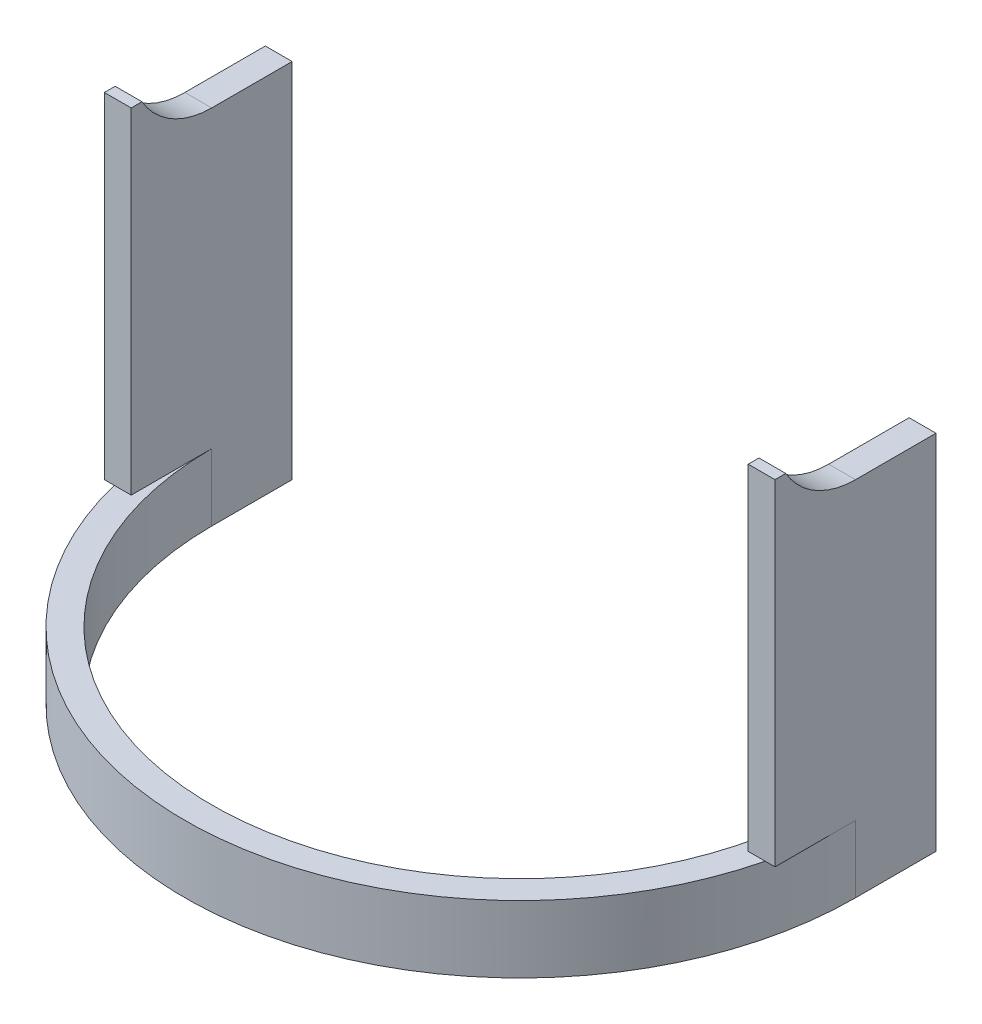
ISO-10303-21;
HEADER;
FILE_DESCRIPTION(('STEP AP214'),'2;1');
FILE_NAME('part.step','',(''),(''),'','','');
FILE_SCHEMA(('AUTOMOTIVE_DESIGN { 1 0 10303 214 1 1 1 1 }'));
ENDSEC;
DATA;
#1=APPLICATION_CONTEXT('core data for automotive mechanical design processes');
#2=APPLICATION_PROTOCOL_DEFINITION('international standard','automotive_design',2000,#1);
#3=PRODUCT_CONTEXT('',#1,'mechanical');
#4=PRODUCT('Part','Part','',(#3));
#5=PRODUCT_RELATED_PRODUCT_CATEGORY('part','',(#4));
#6=PRODUCT_DEFINITION_FORMATION('','',#4);
#7=PRODUCT_DEFINITION_CONTEXT('part definition',#1,'design');
#8=PRODUCT_DEFINITION('design','',#6,#7);
#9=PRODUCT_DEFINITION_SHAPE('','',#8);
#10=(LENGTH_UNIT() NAMED_UNIT(*) SI_UNIT(.MILLI.,.METRE.));
#11=(NAMED_UNIT(*) PLANE_ANGLE_UNIT() SI_UNIT($,.RADIAN.));
#12=(NAMED_UNIT(*) SI_UNIT($,.STERADIAN.) SOLID_ANGLE_UNIT());
#13=UNCERTAINTY_MEASURE_WITH_UNIT(LENGTH_MEASURE(1.E-05),#10,'distance_accuracy_value','');
#14=(GEOMETRIC_REPRESENTATION_CONTEXT(3) GLOBAL_UNCERTAINTY_ASSIGNED_CONTEXT((#13)) GLOBAL_UNIT_ASSIGNED_CONTEXT((#10,
#11,#12)) REPRESENTATION_CONTEXT('',''));
#15=CARTESIAN_POINT('',(0.,0.,0.));
#16=DIRECTION('',(0.,0.,1.));
#17=DIRECTION('',(1.,0.,0.));
#18=AXIS2_PLACEMENT_3D('',#15,#16,#17);
#19=CARTESIAN_POINT('',(0.,10.,0.));
#20=DIRECTION('',(0.,1.,0.));
#21=DIRECTION('',(0.,0.,1.));
#22=AXIS2_PLACEMENT_3D('',#19,#20,#21);
#23=PLANE('',#22);
#24=DIRECTION('',(1.,0.,0.));
#25=VECTOR('',#24,1.);
#26=CARTESIAN_POINT('',(50.,10.,12.));
#27=LINE('',#26,#25);
#28=CARTESIAN_POINT('',(46.,10.,12.));
#29=VERTEX_POINT('',#28);
#30=CARTESIAN_POINT('',(48.5386443980464,10.,12.));
#31=VERTEX_POINT('',#30);
#32=EDGE_CURVE('E194',#29,#31,#27,.T.);
#33=ORIENTED_EDGE('',*,*,#32,.F.);
#34=DIRECTION('',(0.,0.,-1.));
#35=VECTOR('',#34,1.);
#36=CARTESIAN_POINT('',(46.,10.,0.));
#37=LINE('',#36,#35);
#38=CARTESIAN_POINT('',(46.,10.,0.));
#39=VERTEX_POINT('',#38);
#40=EDGE_CURVE('E41',#29,#39,#37,.T.);
#41=ORIENTED_EDGE('',*,*,#40,.T.);
#42=CARTESIAN_POINT('',(0.,10.,0.));
#43=DIRECTION('',(0.,-1.,0.));
#44=DIRECTION('',(0.,0.,1.));
#45=AXIS2_PLACEMENT_3D('',#42,#43,#44);
#46=CIRCLE('',#45,46.);
#47=CARTESIAN_POINT('',(-46.,10.,0.));
#48=VERTEX_POINT('',#47);
#49=EDGE_CURVE('E233',#39,#48,#46,.T.);
#50=ORIENTED_EDGE('',*,*,#49,.T.);
#51=DIRECTION('',(0.,0.,-1.));
#52=VECTOR('',#51,1.);
#53=CARTESIAN_POINT('',(-46.,10.,-12.));
#54=LINE('',#53,#52);
#55=CARTESIAN_POINT('',(-46.,10.,12.));
#56=VERTEX_POINT('',#55);
#57=EDGE_CURVE('E211',#56,#48,#54,.T.);
#58=ORIENTED_EDGE('',*,*,#57,.F.);
#59=DIRECTION('',(1.,0.,0.));
#60=VECTOR('',#59,1.);
#61=CARTESIAN_POINT('',(-50.,10.,12.));
#62=LINE('',#61,#60);
#63=CARTESIAN_POINT('',(-48.5386443980464,10.,12.));
#64=VERTEX_POINT('',#63);
#65=EDGE_CURVE('E221',#64,#56,#62,.T.);
#66=ORIENTED_EDGE('',*,*,#65,.F.);
#67=CARTESIAN_POINT('',(0.,10.,0.));
#68=DIRECTION('',(0.,1.,0.));
#69=DIRECTION('',(0.,0.,1.));
#70=AXIS2_PLACEMENT_3D('',#67,#68,#69);
#71=CIRCLE('',#70,50.);
#72=EDGE_CURVE('E234',#64,#31,#71,.T.);
#73=ORIENTED_EDGE('',*,*,#72,.T.);
#74=EDGE_LOOP('',(#33,#41,#50,#58,#66,#73));
#75=FACE_BOUND('',#74,.T.);
#76=ADVANCED_FACE('F33',(#75),#23,.T.);
#77=CARTESIAN_POINT('',(0.,10.,0.));
#78=DIRECTION('',(0.,-1.,0.));
#79=DIRECTION('',(0.,0.,-1.));
#80=AXIS2_PLACEMENT_3D('',#77,#78,#79);
#81=CYLINDRICAL_SURFACE('',#80,50.);
#82=CARTESIAN_POINT('',(0.,0.,0.));
#83=DIRECTION('',(0.,1.,0.));
#84=DIRECTION('',(0.,0.,1.));
#85=AXIS2_PLACEMENT_3D('',#82,#83,#84);
#86=CIRCLE('',#85,50.);
#87=CARTESIAN_POINT('',(-50.,0.,0.));
#88=VERTEX_POINT('',#87);
#89=CARTESIAN_POINT('',(50.,0.,0.));
#90=VERTEX_POINT('',#89);
#91=EDGE_CURVE('E229',#88,#90,#86,.T.);
#92=ORIENTED_EDGE('',*,*,#91,.T.);
#93=DIRECTION('',(0.,-1.,0.));
#94=VECTOR('',#93,1.);
#95=CARTESIAN_POINT('',(50.,10.,0.));
#96=LINE('',#95,#94);
#97=CARTESIAN_POINT('',(50.,10.,0.));
#98=VERTEX_POINT('',#97);
#99=EDGE_CURVE('E274',#98,#90,#96,.T.);
#100=ORIENTED_EDGE('',*,*,#99,.F.);
#101=EDGE_CURVE('E235',#31,#98,#71,.T.);
#102=ORIENTED_EDGE('',*,*,#101,.F.);
#103=ORIENTED_EDGE('',*,*,#72,.F.);
#104=CARTESIAN_POINT('',(-50.,10.,0.));
#105=VERTEX_POINT('',#104);
#106=EDGE_CURVE('E230',#105,#64,#71,.T.);
#107=ORIENTED_EDGE('',*,*,#106,.F.);
#108=DIRECTION('',(0.,-1.,0.));
#109=VECTOR('',#108,1.);
#110=CARTESIAN_POINT('',(-50.,10.,0.));
#111=LINE('',#110,#109);
#112=EDGE_CURVE('E237',#105,#88,#111,.T.);
#113=ORIENTED_EDGE('',*,*,#112,.T.);
#114=EDGE_LOOP('',(#92,#100,#102,#103,#107,#113));
#115=FACE_BOUND('',#114,.T.);
#116=ADVANCED_FACE('F35',(#115),#81,.T.);
#117=CARTESIAN_POINT('',(50.,10.,-12.));
#118=DIRECTION('',(-1.,0.,0.));
#119=DIRECTION('',(0.,0.,1.));
#120=AXIS2_PLACEMENT_3D('',#117,#118,#119);
#121=PLANE('',#120);
#122=DIRECTION('',(0.,0.,-1.));
#123=VECTOR('',#122,1.);
#124=CARTESIAN_POINT('',(50.,54.,0.));
#125=LINE('',#124,#123);
#126=CARTESIAN_POINT('',(50.,54.,0.));
#127=VERTEX_POINT('',#126);
#128=CARTESIAN_POINT('',(50.,54.,-12.));
#129=VERTEX_POINT('',#128);
#130=EDGE_CURVE('E172',#127,#129,#125,.T.);
#131=ORIENTED_EDGE('',*,*,#130,.F.);
#132=CARTESIAN_POINT('',(50.,66.,0.));
#133=DIRECTION('',(1.,0.,0.));
#134=DIRECTION('',(0.,0.,-1.));
#135=AXIS2_PLACEMENT_3D('',#132,#133,#134);
#136=CIRCLE('',#135,12.);
#137=CARTESIAN_POINT('',(50.,60.,10.3923048454133));
#138=VERTEX_POINT('',#137);
#139=EDGE_CURVE('E174',#138,#127,#136,.T.);
#140=ORIENTED_EDGE('',*,*,#139,.F.);
#141=DIRECTION('',(0.,0.,-1.));
#142=VECTOR('',#141,1.);
#143=CARTESIAN_POINT('',(50.,60.,-12.));
#144=LINE('',#143,#142);
#145=CARTESIAN_POINT('',(50.,60.,12.));
#146=VERTEX_POINT('',#145);
#147=EDGE_CURVE('E190',#146,#138,#144,.T.);
#148=ORIENTED_EDGE('',*,*,#147,.F.);
#149=DIRECTION('',(0.,-1.,0.));
#150=VECTOR('',#149,1.);
#151=CARTESIAN_POINT('',(50.,60.,12.));
#152=LINE('',#151,#150);
#153=CARTESIAN_POINT('',(50.,10.,12.));
#154=VERTEX_POINT('',#153);
#155=EDGE_CURVE('E198',#146,#154,#152,.T.);
#156=ORIENTED_EDGE('',*,*,#155,.T.);
#157=DIRECTION('',(0.,0.,-1.));
#158=VECTOR('',#157,1.);
#159=CARTESIAN_POINT('',(50.,10.,-12.));
#160=LINE('',#159,#158);
#161=EDGE_CURVE('E189',#154,#98,#160,.T.);
#162=ORIENTED_EDGE('',*,*,#161,.T.);
#163=ORIENTED_EDGE('',*,*,#99,.T.);
#164=DIRECTION('',(0.,0.,-1.));
#165=VECTOR('',#164,1.);
#166=CARTESIAN_POINT('',(50.,0.,-12.));
#167=LINE('',#166,#165);
#168=CARTESIAN_POINT('',(50.,0.,-12.));
#169=VERTEX_POINT('',#168);
#170=EDGE_CURVE('E240',#90,#169,#167,.T.);
#171=ORIENTED_EDGE('',*,*,#170,.T.);
#172=DIRECTION('',(0.,-1.,0.));
#173=VECTOR('',#172,1.);
#174=CARTESIAN_POINT('',(50.,10.,-12.));
#175=LINE('',#174,#173);
#176=EDGE_CURVE('E272',#129,#169,#175,.T.);
#177=ORIENTED_EDGE('',*,*,#176,.F.);
#178=EDGE_LOOP('',(#131,#140,#148,#156,#162,#163,#171,#177));
#179=FACE_BOUND('',#178,.T.);
#180=ADVANCED_FACE('F306',(#179),#121,.F.);
#181=CARTESIAN_POINT('',(50.,10.,-12.));
#182=DIRECTION('',(0.,0.,1.));
#183=DIRECTION('',(1.,0.,0.));
#184=AXIS2_PLACEMENT_3D('',#181,#182,#183);
#185=PLANE('',#184);
#186=DIRECTION('',(0.,-1.,0.));
#187=VECTOR('',#186,1.);
#188=CARTESIAN_POINT('',(46.,10.,-12.));
#189=LINE('',#188,#187);
#190=CARTESIAN_POINT('',(46.,54.,-12.));
#191=VERTEX_POINT('',#190);
#192=CARTESIAN_POINT('',(46.,0.,-12.));
#193=VERTEX_POINT('',#192);
#194=EDGE_CURVE('E270',#191,#193,#189,.T.);
#195=ORIENTED_EDGE('',*,*,#194,.F.);
#196=DIRECTION('',(1.,0.,0.));
#197=VECTOR('',#196,1.);
#198=CARTESIAN_POINT('',(-50.,54.,-11.9999999999999));
#199=LINE('',#198,#197);
#200=EDGE_CURVE('E157',#191,#129,#199,.T.);
#201=ORIENTED_EDGE('',*,*,#200,.T.);
#202=ORIENTED_EDGE('',*,*,#176,.T.);
#203=DIRECTION('',(-1.,0.,0.));
#204=VECTOR('',#203,1.);
#205=CARTESIAN_POINT('',(50.,0.,-12.));
#206=LINE('',#205,#204);
#207=EDGE_CURVE('E243',#169,#193,#206,.T.);
#208=ORIENTED_EDGE('',*,*,#207,.T.);
#209=EDGE_LOOP('',(#195,#201,#202,#208));
#210=FACE_BOUND('',#209,.T.);
#211=ADVANCED_FACE('F320',(#210),#185,.F.);
#212=CARTESIAN_POINT('',(46.,10.,-12.));
#213=DIRECTION('',(1.,0.,0.));
#214=DIRECTION('',(0.,0.,-1.));
#215=AXIS2_PLACEMENT_3D('',#212,#213,#214);
#216=PLANE('',#215);
#217=DIRECTION('',(0.,0.,1.));
#218=VECTOR('',#217,1.);
#219=CARTESIAN_POINT('',(46.,60.,-12.));
#220=LINE('',#219,#218);
#221=CARTESIAN_POINT('',(46.,60.,10.3923048454133));
#222=VERTEX_POINT('',#221);
#223=CARTESIAN_POINT('',(46.,60.,12.));
#224=VERTEX_POINT('',#223);
#225=EDGE_CURVE('E193',#222,#224,#220,.T.);
#226=ORIENTED_EDGE('',*,*,#225,.F.);
#227=CARTESIAN_POINT('',(46.,66.,0.));
#228=DIRECTION('',(1.,0.,0.));
#229=DIRECTION('',(0.,0.,-1.));
#230=AXIS2_PLACEMENT_3D('',#227,#228,#229);
#231=CIRCLE('',#230,12.);
#232=CARTESIAN_POINT('',(46.,54.,0.));
#233=VERTEX_POINT('',#232);
#234=EDGE_CURVE('E56',#222,#233,#231,.T.);
#235=ORIENTED_EDGE('',*,*,#234,.T.);
#236=DIRECTION('',(0.,0.,-1.));
#237=VECTOR('',#236,1.);
#238=CARTESIAN_POINT('',(46.,54.,-12.));
#239=LINE('',#238,#237);
#240=EDGE_CURVE('E186',#233,#191,#239,.T.);
#241=ORIENTED_EDGE('',*,*,#240,.T.);
#242=ORIENTED_EDGE('',*,*,#194,.T.);
#243=DIRECTION('',(0.,0.,1.));
#244=VECTOR('',#243,1.);
#245=CARTESIAN_POINT('',(46.,0.,-12.));
#246=LINE('',#245,#244);
#247=CARTESIAN_POINT('',(46.,0.,0.));
#248=VERTEX_POINT('',#247);
#249=EDGE_CURVE('E246',#193,#248,#246,.T.);
#250=ORIENTED_EDGE('',*,*,#249,.T.);
#251=DIRECTION('',(0.,-1.,0.));
#252=VECTOR('',#251,1.);
#253=CARTESIAN_POINT('',(46.,10.,0.));
#254=LINE('',#253,#252);
#255=EDGE_CURVE('E267',#39,#248,#254,.T.);
#256=ORIENTED_EDGE('',*,*,#255,.F.);
#257=ORIENTED_EDGE('',*,*,#40,.F.);
#258=DIRECTION('',(0.,-1.,0.));
#259=VECTOR('',#258,1.);
#260=CARTESIAN_POINT('',(46.,60.,12.));
#261=LINE('',#260,#259);
#262=EDGE_CURVE('E206',#224,#29,#261,.T.);
#263=ORIENTED_EDGE('',*,*,#262,.F.);
#264=EDGE_LOOP('',(#226,#235,#241,#242,#250,#256,#257,#263));
#265=FACE_BOUND('',#264,.T.);
#266=ADVANCED_FACE('F325',(#265),#216,.F.);
#267=CARTESIAN_POINT('',(0.,10.,0.));
#268=DIRECTION('',(0.,-1.,0.));
#269=DIRECTION('',(0.,0.,-1.));
#270=AXIS2_PLACEMENT_3D('',#267,#268,#269);
#271=CYLINDRICAL_SURFACE('',#270,46.);
#272=CARTESIAN_POINT('',(0.,0.,0.));
#273=DIRECTION('',(0.,-1.,0.));
#274=DIRECTION('',(0.,0.,1.));
#275=AXIS2_PLACEMENT_3D('',#272,#273,#274);
#276=CIRCLE('',#275,46.);
#277=CARTESIAN_POINT('',(-46.,0.,0.));
#278=VERTEX_POINT('',#277);
#279=EDGE_CURVE('E248',#248,#278,#276,.T.);
#280=ORIENTED_EDGE('',*,*,#279,.T.);
#281=DIRECTION('',(0.,-1.,0.));
#282=VECTOR('',#281,1.);
#283=CARTESIAN_POINT('',(-46.,10.,0.));
#284=LINE('',#283,#282);
#285=EDGE_CURVE('E264',#48,#278,#284,.T.);
#286=ORIENTED_EDGE('',*,*,#285,.F.);
#287=ORIENTED_EDGE('',*,*,#49,.F.);
#288=ORIENTED_EDGE('',*,*,#255,.T.);
#289=EDGE_LOOP('',(#280,#286,#287,#288));
#290=FACE_BOUND('',#289,.T.);
#291=ADVANCED_FACE('F359',(#290),#271,.F.);
#292=CARTESIAN_POINT('',(-46.,10.,-12.));
#293=DIRECTION('',(-1.,0.,0.));
#294=DIRECTION('',(0.,0.,1.));
#295=AXIS2_PLACEMENT_3D('',#292,#293,#294);
#296=PLANE('',#295);
#297=DIRECTION('',(0.,0.,1.));
#298=VECTOR('',#297,1.);
#299=CARTESIAN_POINT('',(-46.,54.,-12.));
#300=LINE('',#299,#298);
#301=CARTESIAN_POINT('',(-46.,54.,-11.9999999999999));
#302=VERTEX_POINT('',#301);
#303=CARTESIAN_POINT('',(-46.,54.,0.));
#304=VERTEX_POINT('',#303);
#305=EDGE_CURVE('E184',#302,#304,#300,.T.);
#306=ORIENTED_EDGE('',*,*,#305,.T.);
#307=CARTESIAN_POINT('',(-46.,66.,0.));
#308=DIRECTION('',(-1.,0.,0.));
#309=DIRECTION('',(0.,0.,1.));
#310=AXIS2_PLACEMENT_3D('',#307,#308,#309);
#311=CIRCLE('',#310,12.);
#312=CARTESIAN_POINT('',(-46.,60.,10.3923048454133));
#313=VERTEX_POINT('',#312);
#314=EDGE_CURVE('E154',#304,#313,#311,.T.);
#315=ORIENTED_EDGE('',*,*,#314,.T.);
#316=DIRECTION('',(0.,0.,-1.));
#317=VECTOR('',#316,1.);
#318=CARTESIAN_POINT('',(-46.,60.,-12.));
#319=LINE('',#318,#317);
#320=CARTESIAN_POINT('',(-46.,60.,12.));
#321=VERTEX_POINT('',#320);
#322=EDGE_CURVE('E213',#321,#313,#319,.T.);
#323=ORIENTED_EDGE('',*,*,#322,.F.);
#324=DIRECTION('',(0.,-1.,0.));
#325=VECTOR('',#324,1.);
#326=CARTESIAN_POINT('',(-46.,60.,12.));
#327=LINE('',#326,#325);
#328=EDGE_CURVE('E216',#321,#56,#327,.T.);
#329=ORIENTED_EDGE('',*,*,#328,.T.);
#330=ORIENTED_EDGE('',*,*,#57,.T.);
#331=ORIENTED_EDGE('',*,*,#285,.T.);
#332=DIRECTION('',(0.,0.,-1.));
#333=VECTOR('',#332,1.);
#334=CARTESIAN_POINT('',(-46.,0.,-12.));
#335=LINE('',#334,#333);
#336=CARTESIAN_POINT('',(-46.,0.,-12.));
#337=VERTEX_POINT('',#336);
#338=EDGE_CURVE('E250',#278,#337,#335,.T.);
#339=ORIENTED_EDGE('',*,*,#338,.T.);
#340=DIRECTION('',(0.,-1.,0.));
#341=VECTOR('',#340,1.);
#342=CARTESIAN_POINT('',(-46.,10.,-12.));
#343=LINE('',#342,#341);
#344=EDGE_CURVE('E262',#302,#337,#343,.T.);
#345=ORIENTED_EDGE('',*,*,#344,.F.);
#346=EDGE_LOOP('',(#306,#315,#323,#329,#330,#331,#339,#345));
#347=FACE_BOUND('',#346,.T.);
#348=ADVANCED_FACE('F290',(#347),#296,.F.);
#349=CARTESIAN_POINT('',(-50.,10.,-12.));
#350=DIRECTION('',(0.,0.,1.));
#351=DIRECTION('',(1.,0.,0.));
#352=AXIS2_PLACEMENT_3D('',#349,#350,#351);
#353=PLANE('',#352);
#354=DIRECTION('',(0.,-1.,0.));
#355=VECTOR('',#354,1.);
#356=CARTESIAN_POINT('',(-50.,10.,-12.));
#357=LINE('',#356,#355);
#358=CARTESIAN_POINT('',(-50.,54.,-11.9999999999999));
#359=VERTEX_POINT('',#358);
#360=CARTESIAN_POINT('',(-50.,0.,-12.));
#361=VERTEX_POINT('',#360);
#362=EDGE_CURVE('E260',#359,#361,#357,.T.);
#363=ORIENTED_EDGE('',*,*,#362,.F.);
#364=EDGE_CURVE('E164',#359,#302,#199,.T.);
#365=ORIENTED_EDGE('',*,*,#364,.T.);
#366=ORIENTED_EDGE('',*,*,#344,.T.);
#367=DIRECTION('',(-1.,0.,0.));
#368=VECTOR('',#367,1.);
#369=CARTESIAN_POINT('',(-50.,0.,-12.));
#370=LINE('',#369,#368);
#371=EDGE_CURVE('E253',#337,#361,#370,.T.);
#372=ORIENTED_EDGE('',*,*,#371,.T.);
#373=EDGE_LOOP('',(#363,#365,#366,#372));
#374=FACE_BOUND('',#373,.T.);
#375=ADVANCED_FACE('F353',(#374),#353,.F.);
#376=CARTESIAN_POINT('',(-50.,10.,-12.));
#377=DIRECTION('',(1.,0.,0.));
#378=DIRECTION('',(0.,0.,-1.));
#379=AXIS2_PLACEMENT_3D('',#376,#377,#378);
#380=PLANE('',#379);
#381=DIRECTION('',(0.,0.,1.));
#382=VECTOR('',#381,1.);
#383=CARTESIAN_POINT('',(-50.,60.,-12.));
#384=LINE('',#383,#382);
#385=CARTESIAN_POINT('',(-50.,60.,10.3923048454133));
#386=VERTEX_POINT('',#385);
#387=CARTESIAN_POINT('',(-50.,60.,12.));
#388=VERTEX_POINT('',#387);
#389=EDGE_CURVE('E171',#386,#388,#384,.T.);
#390=ORIENTED_EDGE('',*,*,#389,.F.);
#391=CARTESIAN_POINT('',(-50.,66.,0.));
#392=DIRECTION('',(1.,0.,0.));
#393=DIRECTION('',(0.,0.,-1.));
#394=AXIS2_PLACEMENT_3D('',#391,#392,#393);
#395=CIRCLE('',#394,12.);
#396=CARTESIAN_POINT('',(-50.,54.,0.));
#397=VERTEX_POINT('',#396);
#398=EDGE_CURVE('E48',#386,#397,#395,.T.);
#399=ORIENTED_EDGE('',*,*,#398,.T.);
#400=DIRECTION('',(0.,0.,-1.));
#401=VECTOR('',#400,1.);
#402=CARTESIAN_POINT('',(-50.,54.,0.));
#403=LINE('',#402,#401);
#404=EDGE_CURVE('E161',#397,#359,#403,.T.);
#405=ORIENTED_EDGE('',*,*,#404,.T.);
#406=ORIENTED_EDGE('',*,*,#362,.T.);
#407=DIRECTION('',(0.,0.,1.));
#408=VECTOR('',#407,1.);
#409=CARTESIAN_POINT('',(-50.,0.,-12.));
#410=LINE('',#409,#408);
#411=EDGE_CURVE('E256',#361,#88,#410,.T.);
#412=ORIENTED_EDGE('',*,*,#411,.T.);
#413=ORIENTED_EDGE('',*,*,#112,.F.);
#414=DIRECTION('',(0.,0.,1.));
#415=VECTOR('',#414,1.);
#416=CARTESIAN_POINT('',(-50.,10.,-12.));
#417=LINE('',#416,#415);
#418=CARTESIAN_POINT('',(-50.,10.,12.));
#419=VERTEX_POINT('',#418);
#420=EDGE_CURVE('E208',#105,#419,#417,.T.);
#421=ORIENTED_EDGE('',*,*,#420,.T.);
#422=DIRECTION('',(0.,-1.,0.));
#423=VECTOR('',#422,1.);
#424=CARTESIAN_POINT('',(-50.,60.,12.));
#425=LINE('',#424,#423);
#426=EDGE_CURVE('E226',#388,#419,#425,.T.);
#427=ORIENTED_EDGE('',*,*,#426,.F.);
#428=EDGE_LOOP('',(#390,#399,#405,#406,#412,#413,#421,#427));
#429=FACE_BOUND('',#428,.T.);
#430=ADVANCED_FACE('F169',(#429),#380,.F.);
#431=CARTESIAN_POINT('',(0.,0.,0.));
#432=DIRECTION('',(0.,1.,0.));
#433=DIRECTION('',(0.,0.,1.));
#434=AXIS2_PLACEMENT_3D('',#431,#432,#433);
#435=PLANE('',#434);
#436=ORIENTED_EDGE('',*,*,#91,.F.);
#437=ORIENTED_EDGE('',*,*,#411,.F.);
#438=ORIENTED_EDGE('',*,*,#371,.F.);
#439=ORIENTED_EDGE('',*,*,#338,.F.);
#440=ORIENTED_EDGE('',*,*,#279,.F.);
#441=ORIENTED_EDGE('',*,*,#249,.F.);
#442=ORIENTED_EDGE('',*,*,#207,.F.);
#443=ORIENTED_EDGE('',*,*,#170,.F.);
#444=EDGE_LOOP('',(#436,#437,#438,#439,#440,#441,#442,#443));
#445=FACE_BOUND('',#444,.T.);
#446=ADVANCED_FACE('F311',(#445),#435,.F.);
#447=CARTESIAN_POINT('',(0.,10.,0.));
#448=DIRECTION('',(0.,1.,0.));
#449=DIRECTION('',(0.,0.,1.));
#450=AXIS2_PLACEMENT_3D('',#447,#448,#449);
#451=PLANE('',#450);
#452=ORIENTED_EDGE('',*,*,#420,.F.);
#453=ORIENTED_EDGE('',*,*,#106,.T.);
#454=EDGE_CURVE('E218',#419,#64,#62,.T.);
#455=ORIENTED_EDGE('',*,*,#454,.F.);
#456=EDGE_LOOP('',(#452,#453,#455));
#457=FACE_BOUND('',#456,.T.);
#458=ADVANCED_FACE('F296',(#457),#451,.F.);
#459=CARTESIAN_POINT('',(-50.,60.,12.));
#460=DIRECTION('',(0.,0.,-1.));
#461=DIRECTION('',(-1.,0.,0.));
#462=AXIS2_PLACEMENT_3D('',#459,#460,#461);
#463=PLANE('',#462);
#464=ORIENTED_EDGE('',*,*,#454,.T.);
#465=ORIENTED_EDGE('',*,*,#65,.T.);
#466=ORIENTED_EDGE('',*,*,#328,.F.);
#467=DIRECTION('',(1.,0.,0.));
#468=VECTOR('',#467,1.);
#469=CARTESIAN_POINT('',(-50.,60.,12.));
#470=LINE('',#469,#468);
#471=EDGE_CURVE('E210',#388,#321,#470,.T.);
#472=ORIENTED_EDGE('',*,*,#471,.F.);
#473=ORIENTED_EDGE('',*,*,#426,.T.);
#474=EDGE_LOOP('',(#464,#465,#466,#472,#473));
#475=FACE_BOUND('',#474,.T.);
#476=ADVANCED_FACE('F283',(#475),#463,.F.);
#477=CARTESIAN_POINT('',(0.,60.,0.));
#478=DIRECTION('',(0.,1.,0.));
#479=DIRECTION('',(0.,0.,1.));
#480=AXIS2_PLACEMENT_3D('',#477,#478,#479);
#481=PLANE('',#480);
#482=DIRECTION('',(1.,0.,0.));
#483=VECTOR('',#482,1.);
#484=CARTESIAN_POINT('',(-50.,60.,10.3923048454133));
#485=LINE('',#484,#483);
#486=EDGE_CURVE('E181',#386,#313,#485,.T.);
#487=ORIENTED_EDGE('',*,*,#486,.F.);
#488=ORIENTED_EDGE('',*,*,#389,.T.);
#489=ORIENTED_EDGE('',*,*,#471,.T.);
#490=ORIENTED_EDGE('',*,*,#322,.T.);
#491=EDGE_LOOP('',(#487,#488,#489,#490));
#492=FACE_BOUND('',#491,.T.);
#493=ADVANCED_FACE('F292',(#492),#481,.T.);
#494=CARTESIAN_POINT('',(0.,10.,0.));
#495=DIRECTION('',(0.,-1.,0.));
#496=DIRECTION('',(0.,0.,-1.));
#497=AXIS2_PLACEMENT_3D('',#494,#495,#496);
#498=PLANE('',#497);
#499=ORIENTED_EDGE('',*,*,#101,.T.);
#500=ORIENTED_EDGE('',*,*,#161,.F.);
#501=EDGE_CURVE('E201',#31,#154,#27,.T.);
#502=ORIENTED_EDGE('',*,*,#501,.F.);
#503=EDGE_LOOP('',(#499,#500,#502));
#504=FACE_BOUND('',#503,.T.);
#505=ADVANCED_FACE('F303',(#504),#498,.T.);
#506=CARTESIAN_POINT('',(50.,60.,12.));
#507=DIRECTION('',(0.,0.,-1.));
#508=DIRECTION('',(-1.,0.,0.));
#509=AXIS2_PLACEMENT_3D('',#506,#507,#508);
#510=PLANE('',#509);
#511=ORIENTED_EDGE('',*,*,#32,.T.);
#512=ORIENTED_EDGE('',*,*,#501,.T.);
#513=ORIENTED_EDGE('',*,*,#155,.F.);
#514=DIRECTION('',(1.,0.,0.));
#515=VECTOR('',#514,1.);
#516=CARTESIAN_POINT('',(50.,60.,12.));
#517=LINE('',#516,#515);
#518=EDGE_CURVE('E196',#224,#146,#517,.T.);
#519=ORIENTED_EDGE('',*,*,#518,.F.);
#520=ORIENTED_EDGE('',*,*,#262,.T.);
#521=EDGE_LOOP('',(#511,#512,#513,#519,#520));
#522=FACE_BOUND('',#521,.T.);
#523=ADVANCED_FACE('F338',(#522),#510,.F.);
#524=CARTESIAN_POINT('',(0.,60.,0.));
#525=DIRECTION('',(0.,-1.,0.));
#526=DIRECTION('',(0.,0.,-1.));
#527=AXIS2_PLACEMENT_3D('',#524,#525,#526);
#528=PLANE('',#527);
#529=ORIENTED_EDGE('',*,*,#147,.T.);
#530=DIRECTION('',(1.,0.,0.));
#531=VECTOR('',#530,1.);
#532=CARTESIAN_POINT('',(-50.,60.,10.3923048454133));
#533=LINE('',#532,#531);
#534=EDGE_CURVE('E11',#138,#222,#533,.F.);
#535=ORIENTED_EDGE('',*,*,#534,.T.);
#536=ORIENTED_EDGE('',*,*,#225,.T.);
#537=ORIENTED_EDGE('',*,*,#518,.T.);
#538=EDGE_LOOP('',(#529,#535,#536,#537));
#539=FACE_BOUND('',#538,.T.);
#540=ADVANCED_FACE('F329',(#539),#528,.F.);
#541=CARTESIAN_POINT('',(-50.,66.,0.));
#542=DIRECTION('',(1.,0.,0.));
#543=DIRECTION('',(0.,0.,-1.));
#544=AXIS2_PLACEMENT_3D('',#541,#542,#543);
#545=CYLINDRICAL_SURFACE('',#544,12.);
#546=ORIENTED_EDGE('',*,*,#534,.F.);
#547=ORIENTED_EDGE('',*,*,#139,.T.);
#548=DIRECTION('',(1.,0.,0.));
#549=VECTOR('',#548,1.);
#550=CARTESIAN_POINT('',(-50.,54.,0.));
#551=LINE('',#550,#549);
#552=EDGE_CURVE('E158',#233,#127,#551,.T.);
#553=ORIENTED_EDGE('',*,*,#552,.F.);
#554=ORIENTED_EDGE('',*,*,#234,.F.);
#555=EDGE_LOOP('',(#546,#547,#553,#554));
#556=FACE_BOUND('',#555,.T.);
#557=ADVANCED_FACE('F330',(#556),#545,.F.);
#558=CARTESIAN_POINT('',(-50.,54.,0.));
#559=DIRECTION('',(0.,-1.,0.));
#560=DIRECTION('',(0.,0.,-1.));
#561=AXIS2_PLACEMENT_3D('',#558,#559,#560);
#562=PLANE('',#561);
#563=ORIENTED_EDGE('',*,*,#552,.T.);
#564=ORIENTED_EDGE('',*,*,#130,.T.);
#565=ORIENTED_EDGE('',*,*,#200,.F.);
#566=ORIENTED_EDGE('',*,*,#240,.F.);
#567=EDGE_LOOP('',(#563,#564,#565,#566));
#568=FACE_BOUND('',#567,.T.);
#569=ADVANCED_FACE('F322',(#568),#562,.F.);
#570=ORIENTED_EDGE('',*,*,#364,.F.);
#571=ORIENTED_EDGE('',*,*,#404,.F.);
#572=EDGE_CURVE('E150',#397,#304,#551,.T.);
#573=ORIENTED_EDGE('',*,*,#572,.T.);
#574=ORIENTED_EDGE('',*,*,#305,.F.);
#575=EDGE_LOOP('',(#570,#571,#573,#574));
#576=FACE_BOUND('',#575,.T.);
#577=ADVANCED_FACE('F162',(#576),#562,.F.);
#578=ORIENTED_EDGE('',*,*,#572,.F.);
#579=ORIENTED_EDGE('',*,*,#398,.F.);
#580=ORIENTED_EDGE('',*,*,#486,.T.);
#581=ORIENTED_EDGE('',*,*,#314,.F.);
#582=EDGE_LOOP('',(#578,#579,#580,#581));
#583=FACE_BOUND('',#582,.T.);
#584=ADVANCED_FACE('F152',(#583),#545,.F.);
#585=CLOSED_SHELL('',(#76,#116,#180,#211,#266,#291,#348,#375,#430,#446,#458,#476,#493,#505,#523,
#540,#557,#569,#577,#584));
#586=MANIFOLD_SOLID_BREP('B2',#585);
#587=ADVANCED_BREP_SHAPE_REPRESENTATION('',(#18,#586),#14);
#588=SHAPE_DEFINITION_REPRESENTATION(#9,#587);
ENDSEC;
END-ISO-10303-21;
